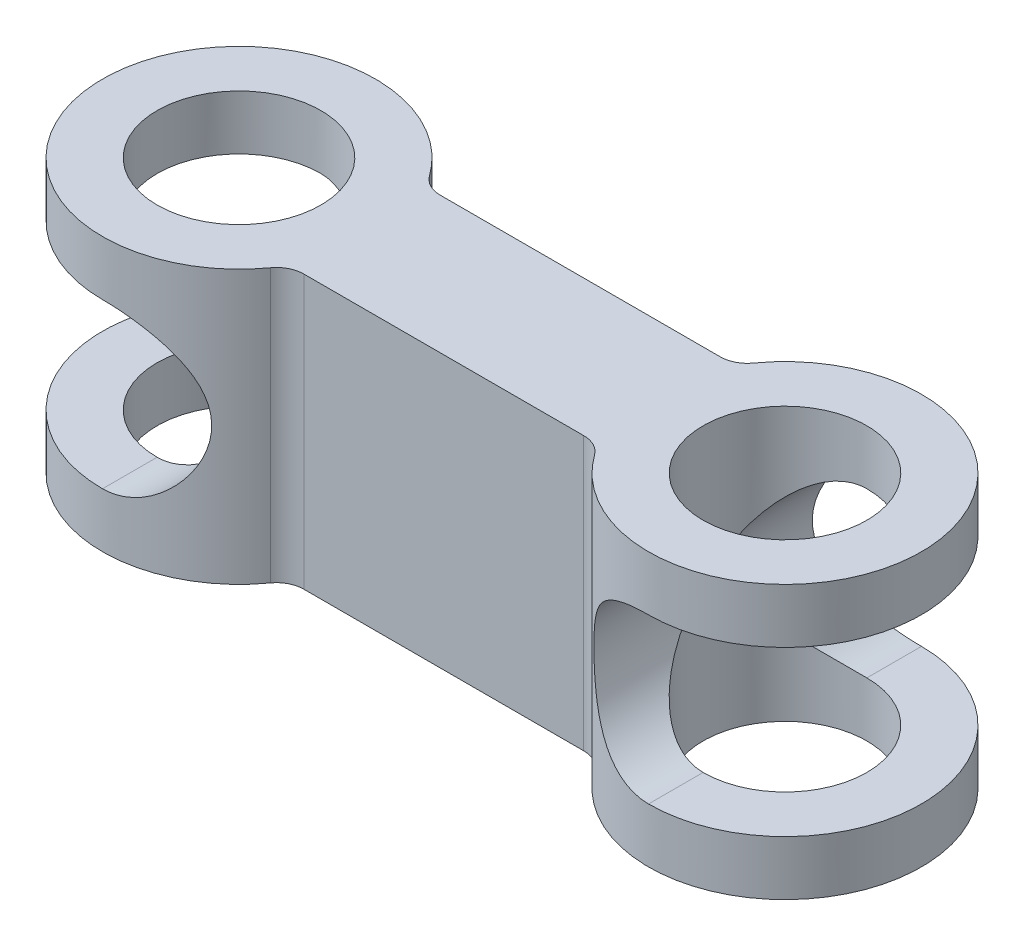
ISO-10303-21;
HEADER;
FILE_DESCRIPTION(('STEP AP214'),'2;1');
FILE_NAME('part.step','',(''),(''),'','','');
FILE_SCHEMA(('AUTOMOTIVE_DESIGN { 1 0 10303 214 1 1 1 1 }'));
ENDSEC;
DATA;
#1=APPLICATION_CONTEXT('core data for automotive mechanical design processes');
#2=APPLICATION_PROTOCOL_DEFINITION('international standard','automotive_design',2000,#1);
#3=PRODUCT_CONTEXT('',#1,'mechanical');
#4=PRODUCT('Part','Part','',(#3));
#5=PRODUCT_RELATED_PRODUCT_CATEGORY('part','',(#4));
#6=PRODUCT_DEFINITION_FORMATION('','',#4);
#7=PRODUCT_DEFINITION_CONTEXT('part definition',#1,'design');
#8=PRODUCT_DEFINITION('design','',#6,#7);
#9=PRODUCT_DEFINITION_SHAPE('','',#8);
#10=(LENGTH_UNIT() NAMED_UNIT(*) SI_UNIT(.MILLI.,.METRE.));
#11=(NAMED_UNIT(*) PLANE_ANGLE_UNIT() SI_UNIT($,.RADIAN.));
#12=(NAMED_UNIT(*) SI_UNIT($,.STERADIAN.) SOLID_ANGLE_UNIT());
#13=UNCERTAINTY_MEASURE_WITH_UNIT(LENGTH_MEASURE(1.E-05),#10,'distance_accuracy_value','');
#14=(GEOMETRIC_REPRESENTATION_CONTEXT(3) GLOBAL_UNCERTAINTY_ASSIGNED_CONTEXT((#13)) GLOBAL_UNIT_ASSIGNED_CONTEXT((#10,
#11,#12)) REPRESENTATION_CONTEXT('',''));
#15=CARTESIAN_POINT('',(0.,0.,0.));
#16=DIRECTION('',(0.,0.,1.));
#17=DIRECTION('',(1.,0.,0.));
#18=AXIS2_PLACEMENT_3D('',#15,#16,#17);
#19=CARTESIAN_POINT('',(20.,24.142135623731,0.));
#20=DIRECTION('',(0.,-1.,0.));
#21=DIRECTION('',(0.,0.,-1.));
#22=AXIS2_PLACEMENT_3D('',#19,#20,#21);
#23=CYLINDRICAL_SURFACE('',#22,5.);
#24=CARTESIAN_POINT('',(20.,0.,0.));
#25=DIRECTION('',(0.,-1.,0.));
#26=DIRECTION('',(0.,0.,1.));
#27=AXIS2_PLACEMENT_3D('',#24,#25,#26);
#28=CIRCLE('',#27,5.);
#29=CARTESIAN_POINT('',(15.9388356896629,0.,-2.91666666666667));
#30=VERTEX_POINT('',#29);
#31=CARTESIAN_POINT('',(15.9388356896629,0.,2.91666666666667));
#32=VERTEX_POINT('',#31);
#33=EDGE_CURVE('E254',#30,#32,#28,.T.);
#34=ORIENTED_EDGE('',*,*,#33,.F.);
#35=DIRECTION('',(0.,-1.,0.));
#36=VECTOR('',#35,1.);
#37=CARTESIAN_POINT('',(15.9388356896629,24.142135623731,-2.91666666666667));
#38=LINE('',#37,#36);
#39=CARTESIAN_POINT('',(15.9388356896629,10.,-2.91666666666667));
#40=VERTEX_POINT('',#39);
#41=EDGE_CURVE('E234',#30,#40,#38,.F.);
#42=ORIENTED_EDGE('',*,*,#41,.T.);
#43=CARTESIAN_POINT('',(20.,10.,0.));
#44=DIRECTION('',(0.,1.,0.));
#45=DIRECTION('',(0.,0.,1.));
#46=AXIS2_PLACEMENT_3D('',#43,#44,#45);
#47=CIRCLE('',#46,5.);
#48=CARTESIAN_POINT('',(15.9388356896629,10.,2.91666666666667));
#49=VERTEX_POINT('',#48);
#50=EDGE_CURVE('E247',#40,#49,#47,.F.);
#51=ORIENTED_EDGE('',*,*,#50,.T.);
#52=DIRECTION('',(0.,-1.,0.));
#53=VECTOR('',#52,1.);
#54=CARTESIAN_POINT('',(15.9388356896629,24.142135623731,2.91666666666667));
#55=LINE('',#54,#53);
#56=EDGE_CURVE('E228',#49,#32,#55,.T.);
#57=ORIENTED_EDGE('',*,*,#56,.T.);
#58=EDGE_LOOP('',(#34,#42,#51,#57));
#59=FACE_BOUND('',#58,.T.);
#60=CARTESIAN_POINT('',(20.,2.,0.));
#61=DIRECTION('',(0.,1.,0.));
#62=DIRECTION('',(0.,0.,1.));
#63=AXIS2_PLACEMENT_3D('',#60,#61,#62);
#64=CIRCLE('',#63,5.);
#65=CARTESIAN_POINT('',(20.,2.,-5.));
#66=VERTEX_POINT('',#65);
#67=CARTESIAN_POINT('',(20.,2.,5.));
#68=VERTEX_POINT('',#67);
#69=EDGE_CURVE('E165',#66,#68,#64,.F.);
#70=ORIENTED_EDGE('',*,*,#69,.T.);
#71=CARTESIAN_POINT('',(20.,2.,5.));
#72=CARTESIAN_POINT('',(19.9228585937771,1.99998597646933,5.00001550025202));
#73=CARTESIAN_POINT('',(19.8457275597749,2.00297495614088,4.99821520229097));
#74=CARTESIAN_POINT('',(19.692121870267,2.01485011540271,4.99109993407428));
#75=CARTESIAN_POINT('',(19.6156469032461,2.02373331905781,4.98578673745113));
#76=CARTESIAN_POINT('',(19.4643284608028,2.04722335139537,4.97180106040882));
#77=CARTESIAN_POINT('',(19.389478312618,2.06179833605021,4.96314727276862));
#78=CARTESIAN_POINT('',(19.2415214252586,2.09646919116128,4.94270141798681));
#79=CARTESIAN_POINT('',(19.1684148313508,2.11656551990202,4.93090909034155));
#80=CARTESIAN_POINT('',(18.9526842479204,2.18472088186145,4.89125830601941));
#81=CARTESIAN_POINT('',(18.8132617471665,2.24070789743841,4.85908815996066));
#82=CARTESIAN_POINT('',(18.5461011386273,2.3716176684363,4.78596424168129));
#83=CARTESIAN_POINT('',(18.4183771554995,2.44656291377018,4.7450000459856));
#84=CARTESIAN_POINT('',(18.1673962656669,2.61955630237699,4.65410357289328));
#85=CARTESIAN_POINT('',(18.0452116546344,2.71892495573595,4.60372689949431));
#86=CARTESIAN_POINT('',(17.8182139016428,2.93495586170392,4.50059910222951));
#87=CARTESIAN_POINT('',(17.7134202081901,3.05163720290322,4.44784540278803));
#88=CARTESIAN_POINT('',(17.511100141072,3.315847534088,4.33822112695084));
#89=CARTESIAN_POINT('',(17.4160439319938,3.46540491043497,4.28163983678159));
#90=CARTESIAN_POINT('',(17.2527704488638,3.78169475257987,4.17876557612389));
#91=CARTESIAN_POINT('',(17.1845093680399,3.9483986179599,4.13245586723177));
#92=CARTESIAN_POINT('',(17.0911882613031,4.2531920164544,4.06709278390524));
#93=CARTESIAN_POINT('',(17.0596764821942,4.38847018672845,4.04415796840962));
#94=CARTESIAN_POINT('',(17.0156767146196,4.66360556449641,4.01180629314329));
#95=CARTESIAN_POINT('',(17.0031653257232,4.80345692244881,4.00237280628201));
#96=CARTESIAN_POINT('',(16.9978898190188,5.08402329607606,3.99841844471282));
#97=CARTESIAN_POINT('',(17.0051643610586,5.22473946578421,4.00392676483381));
#98=CARTESIAN_POINT('',(17.0390789097342,5.50255815138851,4.02906531443466));
#99=CARTESIAN_POINT('',(17.0657333982454,5.63965788542614,4.04870610444229));
#100=CARTESIAN_POINT('',(17.1365216853842,5.905060991022,4.09906383497498));
#101=CARTESIAN_POINT('',(17.1804253179506,6.03345509247912,4.12963446700525));
#102=CARTESIAN_POINT('',(17.2840992764309,6.28139091760368,4.19854132676723));
#103=CARTESIAN_POINT('',(17.343875296557,6.40092944461436,4.23688034023069));
#104=CARTESIAN_POINT('',(17.4896379178928,6.64996438777623,4.32510519863025));
#105=CARTESIAN_POINT('',(17.5783796796568,6.77754888055253,4.37583797623969));
#106=CARTESIAN_POINT('',(17.7741729935459,7.01734682172302,4.47860912189424));
#107=CARTESIAN_POINT('',(17.8812430655461,7.12954451390759,4.53064876462921));
#108=CARTESIAN_POINT('',(18.1283921576648,7.3512428092642,4.63871841685804));
#109=CARTESIAN_POINT('',(18.2709923163763,7.45818376580063,4.69429237571026));
#110=CARTESIAN_POINT('',(18.5755106483022,7.6462708189549,4.79546297464963));
#111=CARTESIAN_POINT('',(18.7374126578633,7.72743829285295,4.8410678735314));
#112=CARTESIAN_POINT('',(19.0433950550039,7.84718368139444,4.90963920598383));
#113=CARTESIAN_POINT('',(19.1848516015556,7.89096615665479,4.93527978090391));
#114=CARTESIAN_POINT('',(19.4741319263094,7.9572536874028,4.97439606890041));
#115=CARTESIAN_POINT('',(19.6219393454,7.97981034209432,4.98790127898447));
#116=CARTESIAN_POINT('',(19.8088302600745,7.99414964789044,4.9964921244036));
#117=CARTESIAN_POINT('',(19.8470374632551,7.99634348382761,4.99780705222993));
#118=CARTESIAN_POINT('',(19.9234917006134,7.99926683955921,4.9995597588117));
#119=CARTESIAN_POINT('',(19.9617386627547,7.99999774476819,4.99999836745218));
#120=CARTESIAN_POINT('',(20.,8.,5.));
#121=B_SPLINE_CURVE_WITH_KNOTS('',3,(#71,#72,#73,#74,#75,#76,#77,#78,#79,#80,#81,#82,#83,#84,
#85,#86,#87,#88,#89,#90,#91,#92,#93,#94,#95,#96,#97,#98,#99,#100,#101,#102,#103,#104,#105,#106,
#107,#108,#109,#110,#111,#112,#113,#114,#115,#116,#117,#118,#119,#120),.UNSPECIFIED.,.F.,.F.,(4,
2,2,2,2,2,2,2,2,2,2,2,2,2,2,2,2,2,2,2,2,2,2,2,4),(0.,0.231328240228348,0.462539773905625,
0.692475856222478,0.92243102954197,1.38117325985713,1.84046226360277,2.33456219846009,
2.82921102203629,3.38456472801073,3.93900667869519,4.35955966268463,4.77959428233625,
5.20045019939585,5.62162092924994,6.03735282155266,6.45323405946918,6.9418120944976,
7.43088676014279,7.98818745066572,8.54502468491722,8.99398548375875,9.44185203395278,
9.55670668456524,9.67145251475948),.UNSPECIFIED.);
#122=CARTESIAN_POINT('',(20.,8.,5.));
#123=VERTEX_POINT('',#122);
#124=EDGE_CURVE('E171',#68,#123,#121,.T.);
#125=ORIENTED_EDGE('',*,*,#124,.T.);
#126=CARTESIAN_POINT('',(20.,8.,0.));
#127=DIRECTION('',(0.,-1.,0.));
#128=DIRECTION('',(0.,0.,-1.));
#129=AXIS2_PLACEMENT_3D('',#126,#127,#128);
#130=CIRCLE('',#129,5.);
#131=CARTESIAN_POINT('',(20.,8.,-5.));
#132=VERTEX_POINT('',#131);
#133=EDGE_CURVE('E153',#123,#132,#130,.F.);
#134=ORIENTED_EDGE('',*,*,#133,.T.);
#135=CARTESIAN_POINT('',(20.,8.,-5.));
#136=CARTESIAN_POINT('',(19.9228585937771,8.00001402353067,-5.00001550025202));
#137=CARTESIAN_POINT('',(19.8457275597749,7.99702504385912,-4.99821520229097));
#138=CARTESIAN_POINT('',(19.692121870267,7.98514988459729,-4.99109993407428));
#139=CARTESIAN_POINT('',(19.6156469032461,7.97626668094219,-4.98578673745113));
#140=CARTESIAN_POINT('',(19.4643284608028,7.95277664860463,-4.97180106040882));
#141=CARTESIAN_POINT('',(19.389478312618,7.93820166394979,-4.96314727276862));
#142=CARTESIAN_POINT('',(19.2415214252586,7.90353080883872,-4.94270141798681));
#143=CARTESIAN_POINT('',(19.1684148313508,7.88343448009798,-4.93090909034155));
#144=CARTESIAN_POINT('',(18.9526842479204,7.81527911813855,-4.89125830601941));
#145=CARTESIAN_POINT('',(18.8132617471665,7.75929210256159,-4.85908815996066));
#146=CARTESIAN_POINT('',(18.5461011386273,7.6283823315637,-4.78596424168129));
#147=CARTESIAN_POINT('',(18.4183771554995,7.55343708622982,-4.7450000459856));
#148=CARTESIAN_POINT('',(18.1673962656669,7.38044369762301,-4.65410357289328));
#149=CARTESIAN_POINT('',(18.0452116546344,7.28107504426405,-4.60372689949431));
#150=CARTESIAN_POINT('',(17.8182139016428,7.06504413829608,-4.50059910222951));
#151=CARTESIAN_POINT('',(17.7134202081901,6.94836279709678,-4.44784540278803));
#152=CARTESIAN_POINT('',(17.511100141072,6.684152465912,-4.33822112695084));
#153=CARTESIAN_POINT('',(17.4160439319938,6.53459508956503,-4.28163983678159));
#154=CARTESIAN_POINT('',(17.2527704488638,6.21830524742013,-4.17876557612389));
#155=CARTESIAN_POINT('',(17.1845093680399,6.0516013820401,-4.13245586723177));
#156=CARTESIAN_POINT('',(17.0911882613031,5.7468079835456,-4.06709278390524));
#157=CARTESIAN_POINT('',(17.0596764821942,5.61152981327155,-4.04415796840962));
#158=CARTESIAN_POINT('',(17.0156767146196,5.33639443550359,-4.01180629314329));
#159=CARTESIAN_POINT('',(17.0031653257232,5.19654307755119,-4.00237280628201));
#160=CARTESIAN_POINT('',(16.9978898190188,4.91597670392394,-3.99841844471282));
#161=CARTESIAN_POINT('',(17.0051643610586,4.77526053421579,-4.00392676483381));
#162=CARTESIAN_POINT('',(17.0390789097342,4.49744184861149,-4.02906531443466));
#163=CARTESIAN_POINT('',(17.0657333982454,4.36034211457386,-4.04870610444229));
#164=CARTESIAN_POINT('',(17.1365216853842,4.094939008978,-4.09906383497498));
#165=CARTESIAN_POINT('',(17.1804253179506,3.96654490752088,-4.12963446700525));
#166=CARTESIAN_POINT('',(17.2840992764309,3.71860908239632,-4.19854132676723));
#167=CARTESIAN_POINT('',(17.343875296557,3.59907055538564,-4.23688034023069));
#168=CARTESIAN_POINT('',(17.4896379178928,3.35003561222377,-4.32510519863025));
#169=CARTESIAN_POINT('',(17.5783796796568,3.22245111944747,-4.37583797623969));
#170=CARTESIAN_POINT('',(17.7741729935459,2.98265317827698,-4.47860912189424));
#171=CARTESIAN_POINT('',(17.8812430655461,2.87045548609242,-4.53064876462921));
#172=CARTESIAN_POINT('',(18.1283921576648,2.6487571907358,-4.63871841685804));
#173=CARTESIAN_POINT('',(18.2709923163763,2.54181623419938,-4.69429237571026));
#174=CARTESIAN_POINT('',(18.5755106483022,2.3537291810451,-4.79546297464963));
#175=CARTESIAN_POINT('',(18.7374126578633,2.27256170714705,-4.8410678735314));
#176=CARTESIAN_POINT('',(19.0433950550039,2.15281631860556,-4.90963920598383));
#177=CARTESIAN_POINT('',(19.1848516015556,2.10903384334521,-4.93527978090391));
#178=CARTESIAN_POINT('',(19.4741319263094,2.0427463125972,-4.97439606890041));
#179=CARTESIAN_POINT('',(19.6219393454,2.02018965790568,-4.98790127898447));
#180=CARTESIAN_POINT('',(19.8088302600745,2.00585035210956,-4.9964921244036));
#181=CARTESIAN_POINT('',(19.8470374632551,2.00365651617239,-4.99780705222993));
#182=CARTESIAN_POINT('',(19.9234917006134,2.00073316044079,-4.9995597588117));
#183=CARTESIAN_POINT('',(19.9617386627547,2.00000225523181,-4.99999836745218));
#184=CARTESIAN_POINT('',(20.,2.,-5.));
#185=B_SPLINE_CURVE_WITH_KNOTS('',3,(#135,#136,#137,#138,#139,#140,#141,#142,#143,#144,#145,
#146,#147,#148,#149,#150,#151,#152,#153,#154,#155,#156,#157,#158,#159,#160,#161,#162,#163,#164,
#165,#166,#167,#168,#169,#170,#171,#172,#173,#174,#175,#176,#177,#178,#179,#180,#181,#182,#183,
#184),.UNSPECIFIED.,.F.,.F.,(4,2,2,2,2,2,2,2,2,2,2,2,2,2,2,2,2,2,2,2,2,2,2,2,4),(0.,
0.231328240228348,0.462539773905625,0.692475856222482,0.92243102954197,1.38117325985713,
1.84046226360277,2.33456219846009,2.8292110220363,3.38456472801073,3.93900667869519,
4.35955966268463,4.77959428233625,5.20045019939585,5.62162092924994,6.03735282155267,
6.45323405946918,6.9418120944976,7.43088676014279,7.98818745066572,8.54502468491722,
8.99398548375875,9.44185203395278,9.55670668456524,9.67145251475948),.UNSPECIFIED.);
#186=EDGE_CURVE('E164',#132,#66,#185,.T.);
#187=ORIENTED_EDGE('',*,*,#186,.T.);
#188=EDGE_LOOP('',(#70,#125,#134,#187));
#189=FACE_BOUND('',#188,.T.);
#190=ADVANCED_FACE('F35',(#59,#189),#23,.T.);
#191=CARTESIAN_POINT('',(20.,10.001,0.));
#192=DIRECTION('',(0.,-1.,0.));
#193=DIRECTION('',(0.,0.,-1.));
#194=AXIS2_PLACEMENT_3D('',#191,#192,#193);
#195=CYLINDRICAL_SURFACE('',#194,3.);
#196=CARTESIAN_POINT('',(20.,10.,0.));
#197=DIRECTION('',(0.,1.,0.));
#198=DIRECTION('',(0.,0.,1.));
#199=AXIS2_PLACEMENT_3D('',#196,#197,#198);
#200=CIRCLE('',#199,3.);
#201=CARTESIAN_POINT('',(20.,10.,3.));
#202=VERTEX_POINT('',#201);
#203=EDGE_CURVE('E179',#202,#202,#200,.F.);
#204=ORIENTED_EDGE('',*,*,#203,.F.);
#205=EDGE_LOOP('',(#204));
#206=FACE_BOUND('',#205,.T.);
#207=CARTESIAN_POINT('',(20.,5.,0.));
#208=DIRECTION('',(0.,-0.707106781186547,-0.707106781186547));
#209=DIRECTION('',(0.,-0.707106781186547,0.707106781186547));
#210=AXIS2_PLACEMENT_3D('',#207,#208,#209);
#211=ELLIPSE('',#210,4.24264068711928,3.);
#212=CARTESIAN_POINT('',(20.,8.,-3.));
#213=VERTEX_POINT('',#212);
#214=CARTESIAN_POINT('',(17.,5.,0.));
#215=VERTEX_POINT('',#214);
#216=EDGE_CURVE('E221',#213,#215,#211,.F.);
#217=ORIENTED_EDGE('',*,*,#216,.F.);
#218=CARTESIAN_POINT('',(20.,8.,0.));
#219=DIRECTION('',(0.,-1.,0.));
#220=DIRECTION('',(0.,0.,-1.));
#221=AXIS2_PLACEMENT_3D('',#218,#219,#220);
#222=CIRCLE('',#221,3.);
#223=CARTESIAN_POINT('',(20.,8.,3.));
#224=VERTEX_POINT('',#223);
#225=EDGE_CURVE('E222',#224,#213,#222,.F.);
#226=ORIENTED_EDGE('',*,*,#225,.F.);
#227=CARTESIAN_POINT('',(20.,5.,0.));
#228=DIRECTION('',(0.,-0.707106781186547,0.707106781186547));
#229=DIRECTION('',(0.,-0.707106781186547,-0.707106781186547));
#230=AXIS2_PLACEMENT_3D('',#227,#228,#229);
#231=ELLIPSE('',#230,4.24264068711928,3.);
#232=EDGE_CURVE('E174',#215,#224,#231,.F.);
#233=ORIENTED_EDGE('',*,*,#232,.F.);
#234=EDGE_LOOP('',(#217,#226,#233));
#235=FACE_BOUND('',#234,.T.);
#236=ADVANCED_FACE('F206',(#206,#235),#195,.F.);
#237=CARTESIAN_POINT('',(20.,0.,0.));
#238=DIRECTION('',(0.,-1.,0.));
#239=DIRECTION('',(0.,0.,1.));
#240=AXIS2_PLACEMENT_3D('',#237,#238,#239);
#241=CIRCLE('',#240,3.);
#242=CARTESIAN_POINT('',(20.,0.,3.));
#243=VERTEX_POINT('',#242);
#244=EDGE_CURVE('E182',#243,#243,#241,.T.);
#245=ORIENTED_EDGE('',*,*,#244,.T.);
#246=EDGE_LOOP('',(#245));
#247=FACE_BOUND('',#246,.T.);
#248=CARTESIAN_POINT('',(20.,5.,0.));
#249=DIRECTION('',(0.,-0.707106781186547,0.707106781186547));
#250=DIRECTION('',(0.,-0.707106781186547,-0.707106781186547));
#251=AXIS2_PLACEMENT_3D('',#248,#249,#250);
#252=ELLIPSE('',#251,4.24264068711928,3.);
#253=CARTESIAN_POINT('',(20.,2.,-3.));
#254=VERTEX_POINT('',#253);
#255=EDGE_CURVE('E311',#215,#254,#252,.T.);
#256=ORIENTED_EDGE('',*,*,#255,.F.);
#257=CARTESIAN_POINT('',(20.,5.,0.));
#258=DIRECTION('',(0.,-0.707106781186547,-0.707106781186547));
#259=DIRECTION('',(0.,-0.707106781186547,0.707106781186547));
#260=AXIS2_PLACEMENT_3D('',#257,#258,#259);
#261=ELLIPSE('',#260,4.24264068711928,3.);
#262=CARTESIAN_POINT('',(20.,2.,3.));
#263=VERTEX_POINT('',#262);
#264=EDGE_CURVE('E309',#263,#215,#261,.T.);
#265=ORIENTED_EDGE('',*,*,#264,.F.);
#266=CARTESIAN_POINT('',(20.,2.,0.));
#267=DIRECTION('',(0.,1.,0.));
#268=DIRECTION('',(0.,0.,1.));
#269=AXIS2_PLACEMENT_3D('',#266,#267,#268);
#270=CIRCLE('',#269,3.);
#271=EDGE_CURVE('E307',#254,#263,#270,.F.);
#272=ORIENTED_EDGE('',*,*,#271,.F.);
#273=EDGE_LOOP('',(#256,#265,#272));
#274=FACE_BOUND('',#273,.T.);
#275=ADVANCED_FACE('F209',(#247,#274),#195,.F.);
#276=CARTESIAN_POINT('',(0.,24.142135623731,0.));
#277=DIRECTION('',(0.,-1.,0.));
#278=DIRECTION('',(0.,0.,-1.));
#279=AXIS2_PLACEMENT_3D('',#276,#277,#278);
#280=CYLINDRICAL_SURFACE('',#279,5.);
#281=CARTESIAN_POINT('',(0.,10.,0.));
#282=DIRECTION('',(0.,1.,0.));
#283=DIRECTION('',(0.,0.,1.));
#284=AXIS2_PLACEMENT_3D('',#281,#282,#283);
#285=CIRCLE('',#284,5.);
#286=CARTESIAN_POINT('',(4.06116431033707,10.,-2.91666666666667));
#287=VERTEX_POINT('',#286);
#288=CARTESIAN_POINT('',(4.06116431033707,10.,2.91666666666667));
#289=VERTEX_POINT('',#288);
#290=EDGE_CURVE('E263',#287,#289,#285,.T.);
#291=ORIENTED_EDGE('',*,*,#290,.F.);
#292=DIRECTION('',(0.,-1.,0.));
#293=VECTOR('',#292,1.);
#294=CARTESIAN_POINT('',(4.06116431033707,24.142135623731,-2.91666666666667));
#295=LINE('',#294,#293);
#296=CARTESIAN_POINT('',(4.06116431033707,0.,-2.91666666666667));
#297=VERTEX_POINT('',#296);
#298=EDGE_CURVE('E291',#287,#297,#295,.T.);
#299=ORIENTED_EDGE('',*,*,#298,.T.);
#300=CARTESIAN_POINT('',(0.,0.,0.));
#301=DIRECTION('',(0.,1.,0.));
#302=DIRECTION('',(0.,0.,1.));
#303=AXIS2_PLACEMENT_3D('',#300,#301,#302);
#304=CIRCLE('',#303,5.);
#305=CARTESIAN_POINT('',(4.06116431033707,0.,2.91666666666667));
#306=VERTEX_POINT('',#305);
#307=EDGE_CURVE('E267',#297,#306,#304,.T.);
#308=ORIENTED_EDGE('',*,*,#307,.T.);
#309=DIRECTION('',(0.,-1.,0.));
#310=VECTOR('',#309,1.);
#311=CARTESIAN_POINT('',(4.06116431033707,24.142135623731,2.91666666666667));
#312=LINE('',#311,#310);
#313=EDGE_CURVE('E288',#306,#289,#312,.F.);
#314=ORIENTED_EDGE('',*,*,#313,.T.);
#315=EDGE_LOOP('',(#291,#299,#308,#314));
#316=FACE_BOUND('',#315,.T.);
#317=CARTESIAN_POINT('',(0.,8.,0.));
#318=DIRECTION('',(0.,1.,0.));
#319=DIRECTION('',(0.,0.,1.));
#320=AXIS2_PLACEMENT_3D('',#317,#318,#319);
#321=CIRCLE('',#320,5.);
#322=CARTESIAN_POINT('',(0.,8.,-5.));
#323=VERTEX_POINT('',#322);
#324=CARTESIAN_POINT('',(0.,8.,5.));
#325=VERTEX_POINT('',#324);
#326=EDGE_CURVE('E569',#323,#325,#321,.T.);
#327=ORIENTED_EDGE('',*,*,#326,.T.);
#328=CARTESIAN_POINT('',(0.,8.,5.));
#329=CARTESIAN_POINT('',(0.0771414062228746,8.00001402353067,5.00001550025202));
#330=CARTESIAN_POINT('',(0.154272440225103,7.99702504385912,4.99821520229097));
#331=CARTESIAN_POINT('',(0.307878129733011,7.98514988459729,4.99109993407428));
#332=CARTESIAN_POINT('',(0.384353096753867,7.97626668094219,4.98578673745113));
#333=CARTESIAN_POINT('',(0.535671539197178,7.95277664860463,4.97180106040882));
#334=CARTESIAN_POINT('',(0.610521687382044,7.93820166394979,4.96314727276862));
#335=CARTESIAN_POINT('',(0.758478574741453,7.90353080883872,4.94270141798681));
#336=CARTESIAN_POINT('',(0.831585168649239,7.88343448009798,4.93090909034155));
#337=CARTESIAN_POINT('',(1.04731575207964,7.81527911813855,4.89125830601941));
#338=CARTESIAN_POINT('',(1.18673825283346,7.75929210256159,4.85908815996066));
#339=CARTESIAN_POINT('',(1.45389886137266,7.6283823315637,4.78596424168129));
#340=CARTESIAN_POINT('',(1.58162284450045,7.55343708622982,4.7450000459856));
#341=CARTESIAN_POINT('',(1.83260373433312,7.38044369762301,4.65410357289328));
#342=CARTESIAN_POINT('',(1.95478834536559,7.28107504426405,4.60372689949431));
#343=CARTESIAN_POINT('',(2.18178609835724,7.06504413829608,4.50059910222951));
#344=CARTESIAN_POINT('',(2.28657979180989,6.94836279709678,4.44784540278803));
#345=CARTESIAN_POINT('',(2.48889985892796,6.684152465912,4.33822112695084));
#346=CARTESIAN_POINT('',(2.58395606800625,6.53459508956503,4.28163983678159));
#347=CARTESIAN_POINT('',(2.74722955113622,6.21830524742013,4.17876557612389));
#348=CARTESIAN_POINT('',(2.81549063196008,6.0516013820401,4.13245586723177));
#349=CARTESIAN_POINT('',(2.90881173869686,5.7468079835456,4.06709278390524));
#350=CARTESIAN_POINT('',(2.94032351780584,5.61152981327154,4.04415796840962));
#351=CARTESIAN_POINT('',(2.98432328538044,5.33639443550359,4.01180629314329));
#352=CARTESIAN_POINT('',(2.99683467427683,5.19654307755119,4.00237280628201));
#353=CARTESIAN_POINT('',(3.00211018098124,4.91597670392393,3.99841844471282));
#354=CARTESIAN_POINT('',(2.99483563894143,4.77526053421578,4.00392676483381));
#355=CARTESIAN_POINT('',(2.96092109026582,4.49744184861149,4.02906531443466));
#356=CARTESIAN_POINT('',(2.93426660175463,4.36034211457386,4.04870610444229));
#357=CARTESIAN_POINT('',(2.86347831461583,4.09493900897799,4.09906383497498));
#358=CARTESIAN_POINT('',(2.81957468204943,3.96654490752088,4.12963446700525));
#359=CARTESIAN_POINT('',(2.71590072356911,3.71860908239632,4.19854132676723));
#360=CARTESIAN_POINT('',(2.65612470344299,3.59907055538564,4.23688034023069));
#361=CARTESIAN_POINT('',(2.5103620821072,3.35003561222377,4.32510519863025));
#362=CARTESIAN_POINT('',(2.42162032034318,3.22245111944746,4.37583797623969));
#363=CARTESIAN_POINT('',(2.22582700645413,2.98265317827698,4.47860912189424));
#364=CARTESIAN_POINT('',(2.11875693445392,2.87045548609241,4.53064876462921));
#365=CARTESIAN_POINT('',(1.87160784233521,2.6487571907358,4.63871841685804));
#366=CARTESIAN_POINT('',(1.72900768362372,2.54181623419937,4.69429237571026));
#367=CARTESIAN_POINT('',(1.42448935169784,2.3537291810451,4.79546297464963));
#368=CARTESIAN_POINT('',(1.26258734213673,2.27256170714705,4.8410678735314));
#369=CARTESIAN_POINT('',(0.956604944996132,2.15281631860556,4.90963920598383));
#370=CARTESIAN_POINT('',(0.815148398444378,2.10903384334521,4.93527978090391));
#371=CARTESIAN_POINT('',(0.525868073690555,2.0427463125972,4.97439606890041));
#372=CARTESIAN_POINT('',(0.378060654599952,2.02018965790568,4.98790127898447));
#373=CARTESIAN_POINT('',(0.191169739925511,2.00585035210956,4.9964921244036));
#374=CARTESIAN_POINT('',(0.152962536744894,2.00365651617239,4.99780705222993));
#375=CARTESIAN_POINT('',(0.0765082993865988,2.00073316044079,4.9995597588117));
#376=CARTESIAN_POINT('',(0.0382613372452819,2.00000225523181,4.99999836745218));
#377=CARTESIAN_POINT('',(0.,2.,5.));
#378=B_SPLINE_CURVE_WITH_KNOTS('',3,(#328,#329,#330,#331,#332,#333,#334,#335,#336,#337,#338,
#339,#340,#341,#342,#343,#344,#345,#346,#347,#348,#349,#350,#351,#352,#353,#354,#355,#356,#357,
#358,#359,#360,#361,#362,#363,#364,#365,#366,#367,#368,#369,#370,#371,#372,#373,#374,#375,#376,
#377),.UNSPECIFIED.,.F.,.F.,(4,2,2,2,2,2,2,2,2,2,2,2,2,2,2,2,2,2,2,2,2,2,2,2,4),(0.,
0.23132824022835,0.462539773905629,0.692475856222485,0.922431029541972,1.38117325985713,
1.84046226360277,2.33456219846009,2.8292110220363,3.38456472801074,3.9390066786952,
4.35955966268464,4.77959428233625,5.20045019939585,5.62162092924995,6.03735282155267,
6.45323405946919,6.94181209449761,7.4308867601428,7.98818745066573,8.54502468491722,
8.99398548375876,9.44185203395279,9.55670668456525,9.67145251475948),.UNSPECIFIED.);
#379=CARTESIAN_POINT('',(0.,2.,5.));
#380=VERTEX_POINT('',#379);
#381=EDGE_CURVE('E538',#325,#380,#378,.T.);
#382=ORIENTED_EDGE('',*,*,#381,.T.);
#383=CARTESIAN_POINT('',(0.,2.,0.));
#384=DIRECTION('',(0.,-1.,0.));
#385=DIRECTION('',(0.,0.,-1.));
#386=AXIS2_PLACEMENT_3D('',#383,#384,#385);
#387=CIRCLE('',#386,5.);
#388=CARTESIAN_POINT('',(0.,2.,-5.));
#389=VERTEX_POINT('',#388);
#390=EDGE_CURVE('E573',#380,#389,#387,.T.);
#391=ORIENTED_EDGE('',*,*,#390,.T.);
#392=CARTESIAN_POINT('',(0.,2.,-5.));
#393=CARTESIAN_POINT('',(0.0771414062228742,1.99998597646933,-5.00001550025202));
#394=CARTESIAN_POINT('',(0.154272440225103,2.00297495614088,-4.99821520229097));
#395=CARTESIAN_POINT('',(0.30787812973301,2.01485011540271,-4.99109993407428));
#396=CARTESIAN_POINT('',(0.384353096753867,2.02373331905781,-4.98578673745113));
#397=CARTESIAN_POINT('',(0.535671539197177,2.04722335139537,-4.97180106040882));
#398=CARTESIAN_POINT('',(0.610521687382042,2.06179833605021,-4.96314727276862));
#399=CARTESIAN_POINT('',(0.758478574741452,2.09646919116128,-4.94270141798681));
#400=CARTESIAN_POINT('',(0.831585168649238,2.11656551990202,-4.93090909034155));
#401=CARTESIAN_POINT('',(1.04731575207964,2.18472088186145,-4.89125830601941));
#402=CARTESIAN_POINT('',(1.18673825283346,2.24070789743841,-4.85908815996066));
#403=CARTESIAN_POINT('',(1.45389886137266,2.3716176684363,-4.78596424168129));
#404=CARTESIAN_POINT('',(1.58162284450045,2.44656291377018,-4.7450000459856));
#405=CARTESIAN_POINT('',(1.83260373433312,2.61955630237699,-4.65410357289328));
#406=CARTESIAN_POINT('',(1.95478834536558,2.71892495573595,-4.60372689949431));
#407=CARTESIAN_POINT('',(2.18178609835724,2.93495586170392,-4.50059910222951));
#408=CARTESIAN_POINT('',(2.28657979180989,3.05163720290322,-4.44784540278803));
#409=CARTESIAN_POINT('',(2.48889985892796,3.315847534088,-4.33822112695084));
#410=CARTESIAN_POINT('',(2.58395606800625,3.46540491043497,-4.28163983678159));
#411=CARTESIAN_POINT('',(2.74722955113622,3.78169475257987,-4.17876557612389));
#412=CARTESIAN_POINT('',(2.81549063196008,3.9483986179599,-4.13245586723177));
#413=CARTESIAN_POINT('',(2.90881173869686,4.2531920164544,-4.06709278390524));
#414=CARTESIAN_POINT('',(2.94032351780584,4.38847018672846,-4.04415796840962));
#415=CARTESIAN_POINT('',(2.98432328538044,4.66360556449641,-4.01180629314329));
#416=CARTESIAN_POINT('',(2.99683467427683,4.80345692244881,-4.00237280628201));
#417=CARTESIAN_POINT('',(3.00211018098124,5.08402329607607,-3.99841844471282));
#418=CARTESIAN_POINT('',(2.99483563894143,5.22473946578422,-4.00392676483381));
#419=CARTESIAN_POINT('',(2.96092109026582,5.50255815138852,-4.02906531443466));
#420=CARTESIAN_POINT('',(2.93426660175463,5.63965788542615,-4.04870610444229));
#421=CARTESIAN_POINT('',(2.86347831461583,5.90506099102201,-4.09906383497498));
#422=CARTESIAN_POINT('',(2.81957468204943,6.03345509247912,-4.12963446700525));
#423=CARTESIAN_POINT('',(2.71590072356911,6.28139091760369,-4.19854132676723));
#424=CARTESIAN_POINT('',(2.65612470344299,6.40092944461437,-4.23688034023069));
#425=CARTESIAN_POINT('',(2.5103620821072,6.64996438777624,-4.32510519863025));
#426=CARTESIAN_POINT('',(2.42162032034318,6.77754888055254,-4.37583797623969));
#427=CARTESIAN_POINT('',(2.22582700645413,7.01734682172303,-4.47860912189424));
#428=CARTESIAN_POINT('',(2.11875693445392,7.12954451390759,-4.53064876462921));
#429=CARTESIAN_POINT('',(1.87160784233521,7.3512428092642,-4.63871841685804));
#430=CARTESIAN_POINT('',(1.72900768362372,7.45818376580063,-4.69429237571026));
#431=CARTESIAN_POINT('',(1.42448935169784,7.6462708189549,-4.79546297464963));
#432=CARTESIAN_POINT('',(1.26258734213673,7.72743829285295,-4.8410678735314));
#433=CARTESIAN_POINT('',(0.956604944996132,7.84718368139444,-4.90963920598383));
#434=CARTESIAN_POINT('',(0.815148398444377,7.89096615665479,-4.93527978090391));
#435=CARTESIAN_POINT('',(0.525868073690555,7.9572536874028,-4.97439606890041));
#436=CARTESIAN_POINT('',(0.378060654599951,7.97981034209432,-4.98790127898447));
#437=CARTESIAN_POINT('',(0.191169739925511,7.99414964789044,-4.9964921244036));
#438=CARTESIAN_POINT('',(0.152962536744894,7.99634348382761,-4.99780705222993));
#439=CARTESIAN_POINT('',(0.076508299386599,7.99926683955921,-4.9995597588117));
#440=CARTESIAN_POINT('',(0.0382613372452823,7.99999774476819,-4.99999836745218));
#441=CARTESIAN_POINT('',(0.,8.,-5.));
#442=B_SPLINE_CURVE_WITH_KNOTS('',3,(#392,#393,#394,#395,#396,#397,#398,#399,#400,#401,#402,
#403,#404,#405,#406,#407,#408,#409,#410,#411,#412,#413,#414,#415,#416,#417,#418,#419,#420,#421,
#422,#423,#424,#425,#426,#427,#428,#429,#430,#431,#432,#433,#434,#435,#436,#437,#438,#439,#440,
#441),.UNSPECIFIED.,.F.,.F.,(4,2,2,2,2,2,2,2,2,2,2,2,2,2,2,2,2,2,2,2,2,2,2,2,4),(0.,
0.23132824022835,0.462539773905629,0.692475856222484,0.922431029541972,1.38117325985713,
1.84046226360277,2.33456219846009,2.8292110220363,3.38456472801074,3.9390066786952,
4.35955966268464,4.77959428233625,5.20045019939585,5.62162092924995,6.03735282155267,
6.45323405946919,6.94181209449761,7.4308867601428,7.98818745066573,8.54502468491723,
8.99398548375876,9.44185203395279,9.55670668456525,9.67145251475948),.UNSPECIFIED.);
#443=EDGE_CURVE('E531',#389,#323,#442,.T.);
#444=ORIENTED_EDGE('',*,*,#443,.T.);
#445=EDGE_LOOP('',(#327,#382,#391,#444));
#446=FACE_BOUND('',#445,.T.);
#447=ADVANCED_FACE('F215',(#316,#446),#280,.T.);
#448=CARTESIAN_POINT('',(0.,10.001,0.));
#449=DIRECTION('',(0.,-1.,0.));
#450=DIRECTION('',(0.,0.,-1.));
#451=AXIS2_PLACEMENT_3D('',#448,#449,#450);
#452=CYLINDRICAL_SURFACE('',#451,3.);
#453=CARTESIAN_POINT('',(0.,5.,0.));
#454=DIRECTION('',(0.,-0.707106781186547,0.707106781186547));
#455=DIRECTION('',(0.,-0.707106781186547,-0.707106781186547));
#456=AXIS2_PLACEMENT_3D('',#453,#454,#455);
#457=ELLIPSE('',#456,4.24264068711928,3.);
#458=CARTESIAN_POINT('',(0.,2.,-3.));
#459=VERTEX_POINT('',#458);
#460=CARTESIAN_POINT('',(3.,5.,0.));
#461=VERTEX_POINT('',#460);
#462=EDGE_CURVE('E286',#459,#461,#457,.T.);
#463=ORIENTED_EDGE('',*,*,#462,.F.);
#464=CARTESIAN_POINT('',(0.,2.,0.));
#465=DIRECTION('',(0.,-1.,0.));
#466=DIRECTION('',(0.,0.,-1.));
#467=AXIS2_PLACEMENT_3D('',#464,#465,#466);
#468=CIRCLE('',#467,3.);
#469=CARTESIAN_POINT('',(0.,2.,3.));
#470=VERTEX_POINT('',#469);
#471=EDGE_CURVE('E284',#470,#459,#468,.T.);
#472=ORIENTED_EDGE('',*,*,#471,.F.);
#473=CARTESIAN_POINT('',(0.,5.,0.));
#474=DIRECTION('',(0.,-0.707106781186547,-0.707106781186547));
#475=DIRECTION('',(0.,-0.707106781186547,0.707106781186547));
#476=AXIS2_PLACEMENT_3D('',#473,#474,#475);
#477=ELLIPSE('',#476,4.24264068711928,3.);
#478=EDGE_CURVE('E278',#461,#470,#477,.T.);
#479=ORIENTED_EDGE('',*,*,#478,.F.);
#480=EDGE_LOOP('',(#463,#472,#479));
#481=FACE_BOUND('',#480,.T.);
#482=CARTESIAN_POINT('',(0.,0.,0.));
#483=DIRECTION('',(0.,1.,0.));
#484=DIRECTION('',(0.,0.,1.));
#485=AXIS2_PLACEMENT_3D('',#482,#483,#484);
#486=CIRCLE('',#485,3.);
#487=CARTESIAN_POINT('',(0.,0.,3.));
#488=VERTEX_POINT('',#487);
#489=EDGE_CURVE('E545',#488,#488,#486,.T.);
#490=ORIENTED_EDGE('',*,*,#489,.F.);
#491=EDGE_LOOP('',(#490));
#492=FACE_BOUND('',#491,.T.);
#493=ADVANCED_FACE('F395',(#481,#492),#452,.F.);
#494=CARTESIAN_POINT('',(0.,10.,2.5));
#495=DIRECTION('',(0.,0.,-1.));
#496=DIRECTION('',(-1.,0.,0.));
#497=AXIS2_PLACEMENT_3D('',#494,#495,#496);
#498=PLANE('',#497);
#499=DIRECTION('',(1.,0.,0.));
#500=VECTOR('',#499,1.);
#501=CARTESIAN_POINT('',(0.,0.,2.5));
#502=LINE('',#501,#500);
#503=CARTESIAN_POINT('',(4.87339717240448,0.,2.5));
#504=VERTEX_POINT('',#503);
#505=CARTESIAN_POINT('',(15.1266028275955,0.,2.5));
#506=VERTEX_POINT('',#505);
#507=EDGE_CURVE('E259',#504,#506,#502,.T.);
#508=ORIENTED_EDGE('',*,*,#507,.T.);
#509=DIRECTION('',(0.,-1.,0.));
#510=VECTOR('',#509,1.);
#511=CARTESIAN_POINT('',(15.1266028275955,10.,2.5));
#512=LINE('',#511,#510);
#513=CARTESIAN_POINT('',(15.1266028275955,10.,2.5));
#514=VERTEX_POINT('',#513);
#515=EDGE_CURVE('E236',#506,#514,#512,.F.);
#516=ORIENTED_EDGE('',*,*,#515,.T.);
#517=DIRECTION('',(1.,0.,0.));
#518=VECTOR('',#517,1.);
#519=CARTESIAN_POINT('',(0.,10.,2.5));
#520=LINE('',#519,#518);
#521=CARTESIAN_POINT('',(4.87339717240448,10.,2.5));
#522=VERTEX_POINT('',#521);
#523=EDGE_CURVE('E250',#522,#514,#520,.T.);
#524=ORIENTED_EDGE('',*,*,#523,.F.);
#525=DIRECTION('',(0.,1.,0.));
#526=VECTOR('',#525,1.);
#527=CARTESIAN_POINT('',(4.87339717240448,0.,2.5));
#528=LINE('',#527,#526);
#529=EDGE_CURVE('E260',#522,#504,#528,.F.);
#530=ORIENTED_EDGE('',*,*,#529,.T.);
#531=EDGE_LOOP('',(#508,#516,#524,#530));
#532=FACE_BOUND('',#531,.T.);
#533=ADVANCED_FACE('F257',(#532),#498,.F.);
#534=CARTESIAN_POINT('',(0.,10.,-2.5));
#535=DIRECTION('',(0.,0.,1.));
#536=DIRECTION('',(1.,0.,0.));
#537=AXIS2_PLACEMENT_3D('',#534,#535,#536);
#538=PLANE('',#537);
#539=DIRECTION('',(-1.,0.,0.));
#540=VECTOR('',#539,1.);
#541=CARTESIAN_POINT('',(0.,10.,-2.5));
#542=LINE('',#541,#540);
#543=CARTESIAN_POINT('',(15.1266028275955,10.,-2.5));
#544=VERTEX_POINT('',#543);
#545=CARTESIAN_POINT('',(4.87339717240448,10.,-2.5));
#546=VERTEX_POINT('',#545);
#547=EDGE_CURVE('E270',#544,#546,#542,.T.);
#548=ORIENTED_EDGE('',*,*,#547,.F.);
#549=DIRECTION('',(0.,-1.,0.));
#550=VECTOR('',#549,1.);
#551=CARTESIAN_POINT('',(15.1266028275955,10.,-2.5));
#552=LINE('',#551,#550);
#553=CARTESIAN_POINT('',(15.1266028275955,0.,-2.5));
#554=VERTEX_POINT('',#553);
#555=EDGE_CURVE('E225',#544,#554,#552,.T.);
#556=ORIENTED_EDGE('',*,*,#555,.T.);
#557=DIRECTION('',(-1.,0.,0.));
#558=VECTOR('',#557,1.);
#559=CARTESIAN_POINT('',(0.,0.,-2.5));
#560=LINE('',#559,#558);
#561=CARTESIAN_POINT('',(4.87339717240448,0.,-2.5));
#562=VERTEX_POINT('',#561);
#563=EDGE_CURVE('E262',#554,#562,#560,.T.);
#564=ORIENTED_EDGE('',*,*,#563,.T.);
#565=DIRECTION('',(0.,1.,0.));
#566=VECTOR('',#565,1.);
#567=CARTESIAN_POINT('',(4.87339717240448,10.,-2.5));
#568=LINE('',#567,#566);
#569=EDGE_CURVE('E294',#562,#546,#568,.T.);
#570=ORIENTED_EDGE('',*,*,#569,.T.);
#571=EDGE_LOOP('',(#548,#556,#564,#570));
#572=FACE_BOUND('',#571,.T.);
#573=ADVANCED_FACE('F408',(#572),#538,.F.);
#574=CARTESIAN_POINT('',(0.,10.,0.));
#575=DIRECTION('',(0.,1.,0.));
#576=DIRECTION('',(0.,0.,1.));
#577=AXIS2_PLACEMENT_3D('',#574,#575,#576);
#578=PLANE('',#577);
#579=ORIENTED_EDGE('',*,*,#203,.T.);
#580=EDGE_LOOP('',(#579));
#581=FACE_BOUND('',#580,.T.);
#582=ORIENTED_EDGE('',*,*,#50,.F.);
#583=CARTESIAN_POINT('',(15.1266028275955,10.,-3.5));
#584=DIRECTION('',(0.,1.,0.));
#585=DIRECTION('',(0.,0.,1.));
#586=AXIS2_PLACEMENT_3D('',#583,#584,#585);
#587=CIRCLE('',#586,1.);
#588=EDGE_CURVE('E240',#40,#544,#587,.F.);
#589=ORIENTED_EDGE('',*,*,#588,.T.);
#590=ORIENTED_EDGE('',*,*,#547,.T.);
#591=CARTESIAN_POINT('',(4.87339717240448,10.,-3.5));
#592=DIRECTION('',(0.,1.,0.));
#593=DIRECTION('',(0.,0.,1.));
#594=AXIS2_PLACEMENT_3D('',#591,#592,#593);
#595=CIRCLE('',#594,1.);
#596=EDGE_CURVE('E301',#546,#287,#595,.F.);
#597=ORIENTED_EDGE('',*,*,#596,.T.);
#598=ORIENTED_EDGE('',*,*,#290,.T.);
#599=CARTESIAN_POINT('',(4.87339717240448,10.,3.5));
#600=DIRECTION('',(0.,1.,0.));
#601=DIRECTION('',(0.,0.,1.));
#602=AXIS2_PLACEMENT_3D('',#599,#600,#601);
#603=CIRCLE('',#602,1.);
#604=EDGE_CURVE('E303',#289,#522,#603,.F.);
#605=ORIENTED_EDGE('',*,*,#604,.T.);
#606=ORIENTED_EDGE('',*,*,#523,.T.);
#607=CARTESIAN_POINT('',(15.1266028275955,10.,3.5));
#608=DIRECTION('',(0.,1.,0.));
#609=DIRECTION('',(0.,0.,1.));
#610=AXIS2_PLACEMENT_3D('',#607,#608,#609);
#611=CIRCLE('',#610,1.);
#612=EDGE_CURVE('E43',#514,#49,#611,.F.);
#613=ORIENTED_EDGE('',*,*,#612,.T.);
#614=EDGE_LOOP('',(#582,#589,#590,#597,#598,#605,#606,#613));
#615=FACE_BOUND('',#614,.T.);
#616=CARTESIAN_POINT('',(0.,10.,0.));
#617=DIRECTION('',(0.,1.,0.));
#618=DIRECTION('',(0.,0.,1.));
#619=AXIS2_PLACEMENT_3D('',#616,#617,#618);
#620=CIRCLE('',#619,3.);
#621=CARTESIAN_POINT('',(0.,10.,3.));
#622=VERTEX_POINT('',#621);
#623=EDGE_CURVE('E550',#622,#622,#620,.T.);
#624=ORIENTED_EDGE('',*,*,#623,.F.);
#625=EDGE_LOOP('',(#624));
#626=FACE_BOUND('',#625,.T.);
#627=ADVANCED_FACE('F245',(#581,#615,#626),#578,.T.);
#628=CARTESIAN_POINT('',(0.,0.,0.));
#629=DIRECTION('',(0.,1.,0.));
#630=DIRECTION('',(0.,0.,1.));
#631=AXIS2_PLACEMENT_3D('',#628,#629,#630);
#632=PLANE('',#631);
#633=ORIENTED_EDGE('',*,*,#244,.F.);
#634=EDGE_LOOP('',(#633));
#635=FACE_BOUND('',#634,.T.);
#636=ORIENTED_EDGE('',*,*,#563,.F.);
#637=CARTESIAN_POINT('',(15.1266028275955,0.,-3.5));
#638=DIRECTION('',(0.,1.,0.));
#639=DIRECTION('',(0.,0.,1.));
#640=AXIS2_PLACEMENT_3D('',#637,#638,#639);
#641=CIRCLE('',#640,1.);
#642=EDGE_CURVE('E238',#554,#30,#641,.T.);
#643=ORIENTED_EDGE('',*,*,#642,.T.);
#644=ORIENTED_EDGE('',*,*,#33,.T.);
#645=CARTESIAN_POINT('',(15.1266028275955,0.,3.5));
#646=DIRECTION('',(0.,1.,0.));
#647=DIRECTION('',(0.,0.,1.));
#648=AXIS2_PLACEMENT_3D('',#645,#646,#647);
#649=CIRCLE('',#648,1.);
#650=EDGE_CURVE('E11',#32,#506,#649,.T.);
#651=ORIENTED_EDGE('',*,*,#650,.T.);
#652=ORIENTED_EDGE('',*,*,#507,.F.);
#653=CARTESIAN_POINT('',(4.87339717240448,0.,3.5));
#654=DIRECTION('',(0.,1.,0.));
#655=DIRECTION('',(0.,0.,1.));
#656=AXIS2_PLACEMENT_3D('',#653,#654,#655);
#657=CIRCLE('',#656,1.);
#658=EDGE_CURVE('E305',#504,#306,#657,.T.);
#659=ORIENTED_EDGE('',*,*,#658,.T.);
#660=ORIENTED_EDGE('',*,*,#307,.F.);
#661=CARTESIAN_POINT('',(4.87339717240448,0.,-3.5));
#662=DIRECTION('',(0.,1.,0.));
#663=DIRECTION('',(0.,0.,1.));
#664=AXIS2_PLACEMENT_3D('',#661,#662,#663);
#665=CIRCLE('',#664,1.);
#666=EDGE_CURVE('E298',#297,#562,#665,.T.);
#667=ORIENTED_EDGE('',*,*,#666,.T.);
#668=EDGE_LOOP('',(#636,#643,#644,#651,#652,#659,#660,#667));
#669=FACE_BOUND('',#668,.T.);
#670=ORIENTED_EDGE('',*,*,#489,.T.);
#671=EDGE_LOOP('',(#670));
#672=FACE_BOUND('',#671,.T.);
#673=ADVANCED_FACE('F392',(#635,#669,#672),#632,.F.);
#674=CARTESIAN_POINT('',(0.,5.,0.));
#675=DIRECTION('',(0.,-0.707106781186547,0.707106781186547));
#676=DIRECTION('',(0.,-0.707106781186547,-0.707106781186547));
#677=AXIS2_PLACEMENT_3D('',#674,#675,#676);
#678=ELLIPSE('',#677,4.24264068711928,3.);
#679=CARTESIAN_POINT('',(0.,8.,3.));
#680=VERTEX_POINT('',#679);
#681=EDGE_CURVE('E281',#680,#461,#678,.F.);
#682=ORIENTED_EDGE('',*,*,#681,.F.);
#683=CARTESIAN_POINT('',(0.,8.,0.));
#684=DIRECTION('',(0.,1.,0.));
#685=DIRECTION('',(0.,0.,1.));
#686=AXIS2_PLACEMENT_3D('',#683,#684,#685);
#687=CIRCLE('',#686,3.);
#688=CARTESIAN_POINT('',(0.,8.,-3.));
#689=VERTEX_POINT('',#688);
#690=EDGE_CURVE('E273',#689,#680,#687,.T.);
#691=ORIENTED_EDGE('',*,*,#690,.F.);
#692=CARTESIAN_POINT('',(0.,5.,0.));
#693=DIRECTION('',(0.,-0.707106781186547,-0.707106781186547));
#694=DIRECTION('',(0.,-0.707106781186547,0.707106781186547));
#695=AXIS2_PLACEMENT_3D('',#692,#693,#694);
#696=ELLIPSE('',#695,4.24264068711928,3.);
#697=EDGE_CURVE('E275',#461,#689,#696,.F.);
#698=ORIENTED_EDGE('',*,*,#697,.F.);
#699=EDGE_LOOP('',(#682,#691,#698));
#700=FACE_BOUND('',#699,.T.);
#701=ORIENTED_EDGE('',*,*,#623,.T.);
#702=EDGE_LOOP('',(#701));
#703=FACE_BOUND('',#702,.T.);
#704=ADVANCED_FACE('F385',(#700,#703),#452,.F.);
#705=CARTESIAN_POINT('',(0.,5.,-5.));
#706=DIRECTION('',(0.,0.,1.));
#707=DIRECTION('',(1.,0.,0.));
#708=AXIS2_PLACEMENT_3D('',#705,#706,#707);
#709=CYLINDRICAL_SURFACE('',#708,3.);
#710=DIRECTION('',(0.,0.,1.));
#711=VECTOR('',#710,1.);
#712=CARTESIAN_POINT('',(0.,8.,-5.));
#713=LINE('',#712,#711);
#714=EDGE_CURVE('E253',#680,#325,#713,.T.);
#715=ORIENTED_EDGE('',*,*,#714,.F.);
#716=ORIENTED_EDGE('',*,*,#681,.T.);
#717=ORIENTED_EDGE('',*,*,#478,.T.);
#718=DIRECTION('',(0.,0.,1.));
#719=VECTOR('',#718,1.);
#720=CARTESIAN_POINT('',(0.,2.,-5.));
#721=LINE('',#720,#719);
#722=EDGE_CURVE('E570',#470,#380,#721,.T.);
#723=ORIENTED_EDGE('',*,*,#722,.T.);
#724=ORIENTED_EDGE('',*,*,#381,.F.);
#725=EDGE_LOOP('',(#715,#716,#717,#723,#724));
#726=FACE_BOUND('',#725,.T.);
#727=ADVANCED_FACE('F377',(#726),#709,.F.);
#728=EDGE_CURVE('E566',#389,#459,#721,.T.);
#729=ORIENTED_EDGE('',*,*,#728,.T.);
#730=ORIENTED_EDGE('',*,*,#462,.T.);
#731=ORIENTED_EDGE('',*,*,#697,.T.);
#732=EDGE_CURVE('E571',#323,#689,#713,.T.);
#733=ORIENTED_EDGE('',*,*,#732,.F.);
#734=ORIENTED_EDGE('',*,*,#443,.F.);
#735=EDGE_LOOP('',(#729,#730,#731,#733,#734));
#736=FACE_BOUND('',#735,.T.);
#737=ADVANCED_FACE('F370',(#736),#709,.F.);
#738=CARTESIAN_POINT('',(0.,2.,-5.));
#739=DIRECTION('',(0.,-1.,0.));
#740=DIRECTION('',(0.,0.,-1.));
#741=AXIS2_PLACEMENT_3D('',#738,#739,#740);
#742=PLANE('',#741);
#743=ORIENTED_EDGE('',*,*,#722,.F.);
#744=ORIENTED_EDGE('',*,*,#471,.T.);
#745=ORIENTED_EDGE('',*,*,#728,.F.);
#746=ORIENTED_EDGE('',*,*,#390,.F.);
#747=EDGE_LOOP('',(#743,#744,#745,#746));
#748=FACE_BOUND('',#747,.T.);
#749=ADVANCED_FACE('F362',(#748),#742,.F.);
#750=CARTESIAN_POINT('',(0.,8.,-5.));
#751=DIRECTION('',(0.,1.,0.));
#752=DIRECTION('',(0.,0.,1.));
#753=AXIS2_PLACEMENT_3D('',#750,#751,#752);
#754=PLANE('',#753);
#755=ORIENTED_EDGE('',*,*,#732,.T.);
#756=ORIENTED_EDGE('',*,*,#690,.T.);
#757=ORIENTED_EDGE('',*,*,#714,.T.);
#758=ORIENTED_EDGE('',*,*,#326,.F.);
#759=EDGE_LOOP('',(#755,#756,#757,#758));
#760=FACE_BOUND('',#759,.T.);
#761=ADVANCED_FACE('F353',(#760),#754,.F.);
#762=CARTESIAN_POINT('',(4.87339717240448,24.142135623731,-3.5));
#763=DIRECTION('',(0.,-1.,0.));
#764=DIRECTION('',(0.,0.,-1.));
#765=AXIS2_PLACEMENT_3D('',#762,#763,#764);
#766=CYLINDRICAL_SURFACE('',#765,1.);
#767=ORIENTED_EDGE('',*,*,#596,.F.);
#768=ORIENTED_EDGE('',*,*,#569,.F.);
#769=ORIENTED_EDGE('',*,*,#666,.F.);
#770=ORIENTED_EDGE('',*,*,#298,.F.);
#771=EDGE_LOOP('',(#767,#768,#769,#770));
#772=FACE_BOUND('',#771,.T.);
#773=ADVANCED_FACE('F344',(#772),#766,.F.);
#774=CARTESIAN_POINT('',(4.87339717240448,24.142135623731,3.5));
#775=DIRECTION('',(0.,-1.,0.));
#776=DIRECTION('',(0.,0.,-1.));
#777=AXIS2_PLACEMENT_3D('',#774,#775,#776);
#778=CYLINDRICAL_SURFACE('',#777,1.);
#779=ORIENTED_EDGE('',*,*,#658,.F.);
#780=ORIENTED_EDGE('',*,*,#529,.F.);
#781=ORIENTED_EDGE('',*,*,#604,.F.);
#782=ORIENTED_EDGE('',*,*,#313,.F.);
#783=EDGE_LOOP('',(#779,#780,#781,#782));
#784=FACE_BOUND('',#783,.T.);
#785=ADVANCED_FACE('F203',(#784),#778,.F.);
#786=CARTESIAN_POINT('',(20.,5.,-5.));
#787=DIRECTION('',(0.,0.,1.));
#788=DIRECTION('',(1.,0.,0.));
#789=AXIS2_PLACEMENT_3D('',#786,#787,#788);
#790=CYLINDRICAL_SURFACE('',#789,3.);
#791=DIRECTION('',(0.,0.,1.));
#792=VECTOR('',#791,1.);
#793=CARTESIAN_POINT('',(20.,2.,-5.));
#794=LINE('',#793,#792);
#795=EDGE_CURVE('E318',#263,#68,#794,.T.);
#796=ORIENTED_EDGE('',*,*,#795,.F.);
#797=ORIENTED_EDGE('',*,*,#264,.T.);
#798=ORIENTED_EDGE('',*,*,#232,.T.);
#799=DIRECTION('',(0.,0.,1.));
#800=VECTOR('',#799,1.);
#801=CARTESIAN_POINT('',(20.,8.,-5.));
#802=LINE('',#801,#800);
#803=EDGE_CURVE('E156',#224,#123,#802,.T.);
#804=ORIENTED_EDGE('',*,*,#803,.T.);
#805=ORIENTED_EDGE('',*,*,#124,.F.);
#806=EDGE_LOOP('',(#796,#797,#798,#804,#805));
#807=FACE_BOUND('',#806,.T.);
#808=ADVANCED_FACE('F170',(#807),#790,.F.);
#809=EDGE_CURVE('E159',#132,#213,#802,.T.);
#810=ORIENTED_EDGE('',*,*,#809,.T.);
#811=ORIENTED_EDGE('',*,*,#216,.T.);
#812=ORIENTED_EDGE('',*,*,#255,.T.);
#813=EDGE_CURVE('E176',#66,#254,#794,.T.);
#814=ORIENTED_EDGE('',*,*,#813,.F.);
#815=ORIENTED_EDGE('',*,*,#186,.F.);
#816=EDGE_LOOP('',(#810,#811,#812,#814,#815));
#817=FACE_BOUND('',#816,.T.);
#818=ADVANCED_FACE('F202',(#817),#790,.F.);
#819=CARTESIAN_POINT('',(20.,8.,-5.));
#820=DIRECTION('',(0.,-1.,0.));
#821=DIRECTION('',(0.,0.,-1.));
#822=AXIS2_PLACEMENT_3D('',#819,#820,#821);
#823=PLANE('',#822);
#824=ORIENTED_EDGE('',*,*,#803,.F.);
#825=ORIENTED_EDGE('',*,*,#225,.T.);
#826=ORIENTED_EDGE('',*,*,#809,.F.);
#827=ORIENTED_EDGE('',*,*,#133,.F.);
#828=EDGE_LOOP('',(#824,#825,#826,#827));
#829=FACE_BOUND('',#828,.T.);
#830=ADVANCED_FACE('F155',(#829),#823,.T.);
#831=CARTESIAN_POINT('',(20.,2.,-5.));
#832=DIRECTION('',(0.,1.,0.));
#833=DIRECTION('',(0.,0.,1.));
#834=AXIS2_PLACEMENT_3D('',#831,#832,#833);
#835=PLANE('',#834);
#836=ORIENTED_EDGE('',*,*,#813,.T.);
#837=ORIENTED_EDGE('',*,*,#271,.T.);
#838=ORIENTED_EDGE('',*,*,#795,.T.);
#839=ORIENTED_EDGE('',*,*,#69,.F.);
#840=EDGE_LOOP('',(#836,#837,#838,#839));
#841=FACE_BOUND('',#840,.T.);
#842=ADVANCED_FACE('F204',(#841),#835,.T.);
#843=CARTESIAN_POINT('',(15.1266028275955,24.142135623731,-3.5));
#844=DIRECTION('',(0.,-1.,0.));
#845=DIRECTION('',(0.,0.,-1.));
#846=AXIS2_PLACEMENT_3D('',#843,#844,#845);
#847=CYLINDRICAL_SURFACE('',#846,1.);
#848=ORIENTED_EDGE('',*,*,#588,.F.);
#849=ORIENTED_EDGE('',*,*,#41,.F.);
#850=ORIENTED_EDGE('',*,*,#642,.F.);
#851=ORIENTED_EDGE('',*,*,#555,.F.);
#852=EDGE_LOOP('',(#848,#849,#850,#851));
#853=FACE_BOUND('',#852,.T.);
#854=ADVANCED_FACE('F322',(#853),#847,.F.);
#855=CARTESIAN_POINT('',(15.1266028275955,24.142135623731,3.5));
#856=DIRECTION('',(0.,-1.,0.));
#857=DIRECTION('',(0.,0.,-1.));
#858=AXIS2_PLACEMENT_3D('',#855,#856,#857);
#859=CYLINDRICAL_SURFACE('',#858,1.);
#860=ORIENTED_EDGE('',*,*,#650,.F.);
#861=ORIENTED_EDGE('',*,*,#56,.F.);
#862=ORIENTED_EDGE('',*,*,#612,.F.);
#863=ORIENTED_EDGE('',*,*,#515,.F.);
#864=EDGE_LOOP('',(#860,#861,#862,#863));
#865=FACE_BOUND('',#864,.T.);
#866=ADVANCED_FACE('F37',(#865),#859,.F.);
#867=CLOSED_SHELL('',(#190,#236,#275,#447,#493,#533,#573,#627,#673,#704,#727,#737,#749,#761,
#773,#785,#808,#818,#830,#842,#854,#866));
#868=MANIFOLD_SOLID_BREP('B2',#867);
#869=ADVANCED_BREP_SHAPE_REPRESENTATION('',(#18,#868),#14);
#870=SHAPE_DEFINITION_REPRESENTATION(#9,#869);
ENDSEC;
END-ISO-10303-21;
